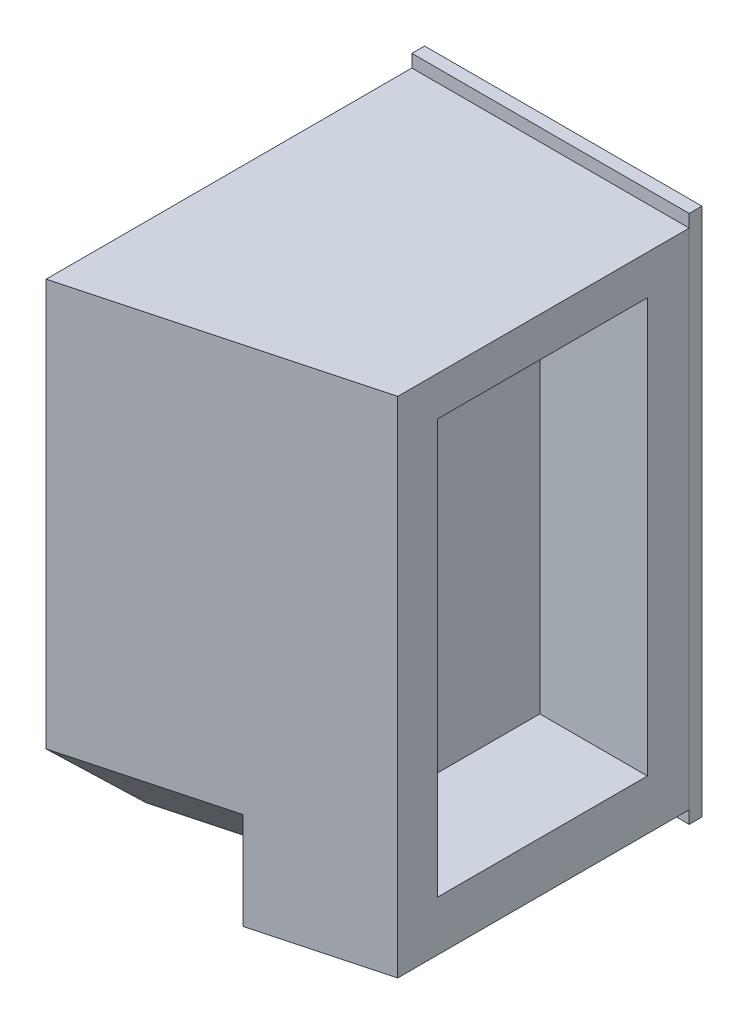
ISO-10303-21;
HEADER;
FILE_DESCRIPTION(('STEP AP214'),'2;1');
FILE_NAME('part.step','',(''),(''),'','','');
FILE_SCHEMA(('AUTOMOTIVE_DESIGN { 1 0 10303 214 1 1 1 1 }'));
ENDSEC;
DATA;
#1=APPLICATION_CONTEXT('core data for automotive mechanical design processes');
#2=APPLICATION_PROTOCOL_DEFINITION('international standard','automotive_design',2000,#1);
#3=PRODUCT_CONTEXT('',#1,'mechanical');
#4=PRODUCT('Part','Part','',(#3));
#5=PRODUCT_RELATED_PRODUCT_CATEGORY('part','',(#4));
#6=PRODUCT_DEFINITION_FORMATION('','',#4);
#7=PRODUCT_DEFINITION_CONTEXT('part definition',#1,'design');
#8=PRODUCT_DEFINITION('design','',#6,#7);
#9=PRODUCT_DEFINITION_SHAPE('','',#8);
#10=(LENGTH_UNIT() NAMED_UNIT(*) SI_UNIT(.MILLI.,.METRE.));
#11=(NAMED_UNIT(*) PLANE_ANGLE_UNIT() SI_UNIT($,.RADIAN.));
#12=(NAMED_UNIT(*) SI_UNIT($,.STERADIAN.) SOLID_ANGLE_UNIT());
#13=UNCERTAINTY_MEASURE_WITH_UNIT(LENGTH_MEASURE(1.E-05),#10,'distance_accuracy_value','');
#14=(GEOMETRIC_REPRESENTATION_CONTEXT(3) GLOBAL_UNCERTAINTY_ASSIGNED_CONTEXT((#13)) GLOBAL_UNIT_ASSIGNED_CONTEXT((#10,
#11,#12)) REPRESENTATION_CONTEXT('',''));
#15=CARTESIAN_POINT('',(0.,0.,0.));
#16=DIRECTION('',(0.,0.,1.));
#17=DIRECTION('',(1.,0.,0.));
#18=AXIS2_PLACEMENT_3D('',#15,#16,#17);
#19=CARTESIAN_POINT('',(-327.080348727841,506.318653049981,217.579868937784));
#20=DIRECTION('',(-1.,0.,0.));
#21=DIRECTION('',(0.,0.,1.));
#22=AXIS2_PLACEMENT_3D('',#19,#20,#21);
#23=PLANE('',#22);
#24=DIRECTION('',(0.,-1.,0.));
#25=VECTOR('',#24,1.);
#26=CARTESIAN_POINT('',(-327.080348727841,506.318653049981,232.579868937784));
#27=LINE('',#26,#25);
#28=CARTESIAN_POINT('',(-327.080348727841,521.318653049981,232.579868937784));
#29=VERTEX_POINT('',#28);
#30=CARTESIAN_POINT('',(-327.080348727841,-103.291624688066,232.579868937784));
#31=VERTEX_POINT('',#30);
#32=EDGE_CURVE('E239',#29,#31,#27,.T.);
#33=ORIENTED_EDGE('',*,*,#32,.F.);
#34=DIRECTION('',(0.,0.,1.));
#35=VECTOR('',#34,1.);
#36=CARTESIAN_POINT('',(-327.080348727841,521.318653049981,232.579868937784));
#37=LINE('',#36,#35);
#38=CARTESIAN_POINT('',(-327.080348727841,521.318653049981,217.579868937784));
#39=VERTEX_POINT('',#38);
#40=EDGE_CURVE('E231',#39,#29,#37,.T.);
#41=ORIENTED_EDGE('',*,*,#40,.F.);
#42=DIRECTION('',(0.,-1.,0.));
#43=VECTOR('',#42,1.);
#44=CARTESIAN_POINT('',(-327.080348727841,506.318653049981,217.579868937784));
#45=LINE('',#44,#43);
#46=CARTESIAN_POINT('',(-327.080348727841,-103.291624688066,217.579868937784));
#47=VERTEX_POINT('',#46);
#48=EDGE_CURVE('E240',#39,#47,#45,.T.);
#49=ORIENTED_EDGE('',*,*,#48,.T.);
#50=DIRECTION('',(0.,0.,1.));
#51=VECTOR('',#50,1.);
#52=CARTESIAN_POINT('',(-327.080348727841,-103.291624688066,232.579868937784));
#53=LINE('',#52,#51);
#54=EDGE_CURVE('E215',#47,#31,#53,.T.);
#55=ORIENTED_EDGE('',*,*,#54,.T.);
#56=EDGE_LOOP('',(#33,#41,#49,#55));
#57=FACE_BOUND('',#56,.T.);
#58=ADVANCED_FACE('F53',(#57),#23,.T.);
#59=CARTESIAN_POINT('',(0.305231487729579,506.318653049981,217.579868937784));
#60=DIRECTION('',(1.,0.,0.));
#61=DIRECTION('',(0.,1.,0.));
#62=AXIS2_PLACEMENT_3D('',#59,#60,#61);
#63=PLANE('',#62);
#64=DIRECTION('',(0.,1.,0.));
#65=VECTOR('',#64,1.);
#66=CARTESIAN_POINT('',(0.305231487729579,506.318653049981,232.579868937784));
#67=LINE('',#66,#65);
#68=CARTESIAN_POINT('',(0.305231487729651,-103.291624688066,232.579868937784));
#69=VERTEX_POINT('',#68);
#70=CARTESIAN_POINT('',(0.305231487729651,521.318653049981,232.579868937784));
#71=VERTEX_POINT('',#70);
#72=EDGE_CURVE('E244',#69,#71,#67,.T.);
#73=ORIENTED_EDGE('',*,*,#72,.F.);
#74=DIRECTION('',(0.,0.,-1.));
#75=VECTOR('',#74,1.);
#76=CARTESIAN_POINT('',(0.305231487729651,-103.291624688066,232.579868937784));
#77=LINE('',#76,#75);
#78=CARTESIAN_POINT('',(0.305231487729651,-103.291624688066,217.579868937784));
#79=VERTEX_POINT('',#78);
#80=EDGE_CURVE('E177',#69,#79,#77,.T.);
#81=ORIENTED_EDGE('',*,*,#80,.T.);
#82=DIRECTION('',(0.,1.,0.));
#83=VECTOR('',#82,1.);
#84=CARTESIAN_POINT('',(0.305231487729579,506.318653049981,217.579868937784));
#85=LINE('',#84,#83);
#86=CARTESIAN_POINT('',(0.305231487729651,521.318653049981,217.579868937784));
#87=VERTEX_POINT('',#86);
#88=EDGE_CURVE('E243',#79,#87,#85,.T.);
#89=ORIENTED_EDGE('',*,*,#88,.T.);
#90=DIRECTION('',(0.,0.,-1.));
#91=VECTOR('',#90,1.);
#92=CARTESIAN_POINT('',(0.305231487729651,521.318653049981,232.579868937784));
#93=LINE('',#92,#91);
#94=EDGE_CURVE('E223',#71,#87,#93,.T.);
#95=ORIENTED_EDGE('',*,*,#94,.F.);
#96=EDGE_LOOP('',(#73,#81,#89,#95));
#97=FACE_BOUND('',#96,.T.);
#98=ADVANCED_FACE('F293',(#97),#63,.T.);
#99=CARTESIAN_POINT('',(0.,0.,217.579868937784));
#100=DIRECTION('',(0.,0.,1.));
#101=DIRECTION('',(1.,0.,0.));
#102=AXIS2_PLACEMENT_3D('',#99,#100,#101);
#103=PLANE('',#102);
#104=DIRECTION('',(-1.,0.,0.));
#105=VECTOR('',#104,1.);
#106=CARTESIAN_POINT('',(-230.062558620056,275.256153049981,217.579868937784));
#107=LINE('',#106,#105);
#108=CARTESIAN_POINT('',(-96.7125586200556,275.256153049981,217.579868937784));
#109=VERTEX_POINT('',#108);
#110=CARTESIAN_POINT('',(-230.062558620056,275.256153049981,217.579868937784));
#111=VERTEX_POINT('',#110);
#112=EDGE_CURVE('E159',#109,#111,#107,.T.);
#113=ORIENTED_EDGE('',*,*,#112,.F.);
#114=DIRECTION('',(0.,-1.,0.));
#115=VECTOR('',#114,1.);
#116=CARTESIAN_POINT('',(-96.7125586200556,275.256153049981,217.579868937784));
#117=LINE('',#116,#115);
#118=CARTESIAN_POINT('',(-96.7125586200556,386.381153049981,217.579868937784));
#119=VERTEX_POINT('',#118);
#120=EDGE_CURVE('E68',#119,#109,#117,.T.);
#121=ORIENTED_EDGE('',*,*,#120,.F.);
#122=DIRECTION('',(1.,0.,0.));
#123=VECTOR('',#122,1.);
#124=CARTESIAN_POINT('',(-230.062558620056,386.381153049981,217.579868937784));
#125=LINE('',#124,#123);
#126=CARTESIAN_POINT('',(-230.062558620056,386.381153049981,217.579868937784));
#127=VERTEX_POINT('',#126);
#128=EDGE_CURVE('E167',#127,#119,#125,.T.);
#129=ORIENTED_EDGE('',*,*,#128,.F.);
#130=DIRECTION('',(0.,1.,0.));
#131=VECTOR('',#130,1.);
#132=CARTESIAN_POINT('',(-230.062558620056,275.256153049981,217.579868937784));
#133=LINE('',#132,#131);
#134=EDGE_CURVE('E148',#111,#127,#133,.T.);
#135=ORIENTED_EDGE('',*,*,#134,.F.);
#136=EDGE_LOOP('',(#113,#121,#129,#135));
#137=FACE_BOUND('',#136,.T.);
#138=DIRECTION('',(0.,-1.,0.));
#139=VECTOR('',#138,1.);
#140=CARTESIAN_POINT('',(-96.7125586200556,142.770875311934,217.579868937784));
#141=LINE('',#140,#139);
#142=CARTESIAN_POINT('',(-96.7125586200556,142.770875311934,217.579868937784));
#143=VERTEX_POINT('',#142);
#144=CARTESIAN_POINT('',(-96.7125586200556,31.6458753119341,217.579868937784));
#145=VERTEX_POINT('',#144);
#146=EDGE_CURVE('E184',#143,#145,#141,.T.);
#147=ORIENTED_EDGE('',*,*,#146,.F.);
#148=DIRECTION('',(1.,0.,0.));
#149=VECTOR('',#148,1.);
#150=CARTESIAN_POINT('',(-230.062558620056,142.770875311934,217.579868937784));
#151=LINE('',#150,#149);
#152=CARTESIAN_POINT('',(-230.062558620056,142.770875311934,217.579868937784));
#153=VERTEX_POINT('',#152);
#154=EDGE_CURVE('E76',#153,#143,#151,.T.);
#155=ORIENTED_EDGE('',*,*,#154,.F.);
#156=DIRECTION('',(0.,1.,0.));
#157=VECTOR('',#156,1.);
#158=CARTESIAN_POINT('',(-230.062558620056,142.770875311934,217.579868937784));
#159=LINE('',#158,#157);
#160=CARTESIAN_POINT('',(-230.062558620056,31.6458753119341,217.579868937784));
#161=VERTEX_POINT('',#160);
#162=EDGE_CURVE('E192',#161,#153,#159,.T.);
#163=ORIENTED_EDGE('',*,*,#162,.F.);
#164=DIRECTION('',(-1.,0.,0.));
#165=VECTOR('',#164,1.);
#166=CARTESIAN_POINT('',(-230.062558620056,31.6458753119341,217.579868937784));
#167=LINE('',#166,#165);
#168=EDGE_CURVE('E188',#145,#161,#167,.T.);
#169=ORIENTED_EDGE('',*,*,#168,.F.);
#170=EDGE_LOOP('',(#147,#155,#163,#169));
#171=FACE_BOUND('',#170,.T.);
#172=ORIENTED_EDGE('',*,*,#48,.F.);
#173=DIRECTION('',(-1.,0.,0.));
#174=VECTOR('',#173,1.);
#175=CARTESIAN_POINT('',(0.305231487729651,521.318653049981,217.579868937784));
#176=LINE('',#175,#174);
#177=EDGE_CURVE('E227',#87,#39,#176,.T.);
#178=ORIENTED_EDGE('',*,*,#177,.F.);
#179=ORIENTED_EDGE('',*,*,#88,.F.);
#180=DIRECTION('',(-1.,0.,0.));
#181=VECTOR('',#180,1.);
#182=CARTESIAN_POINT('',(0.305231487729651,-103.291624688066,217.579868937784));
#183=LINE('',#182,#181);
#184=EDGE_CURVE('E219',#79,#47,#183,.T.);
#185=ORIENTED_EDGE('',*,*,#184,.T.);
#186=EDGE_LOOP('',(#172,#178,#179,#185));
#187=FACE_BOUND('',#186,.T.);
#188=ADVANCED_FACE('F164',(#137,#171,#187),#103,.F.);
#189=CARTESIAN_POINT('',(0.,0.,232.579868937784));
#190=DIRECTION('',(0.,0.,1.));
#191=DIRECTION('',(1.,0.,0.));
#192=AXIS2_PLACEMENT_3D('',#189,#190,#191);
#193=PLANE('',#192);
#194=DIRECTION('',(0.,1.,0.));
#195=VECTOR('',#194,1.);
#196=CARTESIAN_POINT('',(-96.7125586200556,0.,232.579868937784));
#197=LINE('',#196,#195);
#198=CARTESIAN_POINT('',(-96.7125586200556,275.256153049981,232.579868937784));
#199=VERTEX_POINT('',#198);
#200=CARTESIAN_POINT('',(-96.7125586200556,386.381153049981,232.579868937784));
#201=VERTEX_POINT('',#200);
#202=EDGE_CURVE('E12',#199,#201,#197,.T.);
#203=ORIENTED_EDGE('',*,*,#202,.F.);
#204=DIRECTION('',(1.,0.,0.));
#205=VECTOR('',#204,1.);
#206=CARTESIAN_POINT('',(0.,275.256153049981,232.579868937784));
#207=LINE('',#206,#205);
#208=CARTESIAN_POINT('',(-230.062558620056,275.256153049981,232.579868937784));
#209=VERTEX_POINT('',#208);
#210=EDGE_CURVE('E264',#209,#199,#207,.T.);
#211=ORIENTED_EDGE('',*,*,#210,.F.);
#212=DIRECTION('',(0.,-1.,0.));
#213=VECTOR('',#212,1.);
#214=CARTESIAN_POINT('',(-230.062558620056,0.,232.579868937784));
#215=LINE('',#214,#213);
#216=CARTESIAN_POINT('',(-230.062558620056,386.381153049981,232.579868937784));
#217=VERTEX_POINT('',#216);
#218=EDGE_CURVE('E151',#217,#209,#215,.T.);
#219=ORIENTED_EDGE('',*,*,#218,.F.);
#220=DIRECTION('',(-1.,0.,0.));
#221=VECTOR('',#220,1.);
#222=CARTESIAN_POINT('',(0.,386.381153049981,232.579868937784));
#223=LINE('',#222,#221);
#224=EDGE_CURVE('E61',#201,#217,#223,.T.);
#225=ORIENTED_EDGE('',*,*,#224,.F.);
#226=EDGE_LOOP('',(#203,#211,#219,#225));
#227=FACE_BOUND('',#226,.T.);
#228=DIRECTION('',(-1.,0.,0.));
#229=VECTOR('',#228,1.);
#230=CARTESIAN_POINT('',(0.,142.770875311934,232.579868937784));
#231=LINE('',#230,#229);
#232=CARTESIAN_POINT('',(-96.7125586200556,142.770875311934,232.579868937784));
#233=VERTEX_POINT('',#232);
#234=CARTESIAN_POINT('',(-230.062558620056,142.770875311934,232.579868937784));
#235=VERTEX_POINT('',#234);
#236=EDGE_CURVE('E261',#233,#235,#231,.T.);
#237=ORIENTED_EDGE('',*,*,#236,.F.);
#238=DIRECTION('',(0.,1.,0.));
#239=VECTOR('',#238,1.);
#240=CARTESIAN_POINT('',(-96.7125586200556,0.,232.579868937784));
#241=LINE('',#240,#239);
#242=CARTESIAN_POINT('',(-96.7125586200556,31.6458753119341,232.579868937784));
#243=VERTEX_POINT('',#242);
#244=EDGE_CURVE('E247',#243,#233,#241,.T.);
#245=ORIENTED_EDGE('',*,*,#244,.F.);
#246=DIRECTION('',(1.,0.,0.));
#247=VECTOR('',#246,1.);
#248=CARTESIAN_POINT('',(0.,31.6458753119341,232.579868937784));
#249=LINE('',#248,#247);
#250=CARTESIAN_POINT('',(-230.062558620056,31.6458753119341,232.579868937784));
#251=VERTEX_POINT('',#250);
#252=EDGE_CURVE('E254',#251,#243,#249,.T.);
#253=ORIENTED_EDGE('',*,*,#252,.F.);
#254=DIRECTION('',(0.,-1.,0.));
#255=VECTOR('',#254,1.);
#256=CARTESIAN_POINT('',(-230.062558620056,0.,232.579868937784));
#257=LINE('',#256,#255);
#258=EDGE_CURVE('E258',#235,#251,#257,.T.);
#259=ORIENTED_EDGE('',*,*,#258,.F.);
#260=EDGE_LOOP('',(#237,#245,#253,#259));
#261=FACE_BOUND('',#260,.T.);
#262=ORIENTED_EDGE('',*,*,#32,.T.);
#263=DIRECTION('',(1.,0.,0.));
#264=VECTOR('',#263,1.);
#265=CARTESIAN_POINT('',(0.305231487729651,-103.291624688066,232.579868937784));
#266=LINE('',#265,#264);
#267=EDGE_CURVE('E211',#31,#69,#266,.T.);
#268=ORIENTED_EDGE('',*,*,#267,.T.);
#269=ORIENTED_EDGE('',*,*,#72,.T.);
#270=DIRECTION('',(1.,0.,0.));
#271=VECTOR('',#270,1.);
#272=CARTESIAN_POINT('',(0.305231487729651,521.318653049981,232.579868937784));
#273=LINE('',#272,#271);
#274=EDGE_CURVE('E235',#29,#71,#273,.T.);
#275=ORIENTED_EDGE('',*,*,#274,.F.);
#276=EDGE_LOOP('',(#262,#268,#269,#275));
#277=FACE_BOUND('',#276,.T.);
#278=ADVANCED_FACE('F275',(#227,#261,#277),#193,.T.);
#279=CARTESIAN_POINT('',(0.,521.318653049981,0.));
#280=DIRECTION('',(0.,1.,0.));
#281=DIRECTION('',(0.,0.,1.));
#282=AXIS2_PLACEMENT_3D('',#279,#280,#281);
#283=PLANE('',#282);
#284=ORIENTED_EDGE('',*,*,#94,.T.);
#285=ORIENTED_EDGE('',*,*,#177,.T.);
#286=ORIENTED_EDGE('',*,*,#40,.T.);
#287=ORIENTED_EDGE('',*,*,#274,.T.);
#288=EDGE_LOOP('',(#284,#285,#286,#287));
#289=FACE_BOUND('',#288,.T.);
#290=ADVANCED_FACE('F305',(#289),#283,.T.);
#291=CARTESIAN_POINT('',(0.,-103.291624688066,0.));
#292=DIRECTION('',(0.,-1.,0.));
#293=DIRECTION('',(0.,0.,1.));
#294=AXIS2_PLACEMENT_3D('',#291,#292,#293);
#295=PLANE('',#294);
#296=ORIENTED_EDGE('',*,*,#80,.F.);
#297=ORIENTED_EDGE('',*,*,#267,.F.);
#298=ORIENTED_EDGE('',*,*,#54,.F.);
#299=ORIENTED_EDGE('',*,*,#184,.F.);
#300=EDGE_LOOP('',(#296,#297,#298,#299));
#301=FACE_BOUND('',#300,.T.);
#302=ADVANCED_FACE('F311',(#301),#295,.T.);
#303=CARTESIAN_POINT('',(-230.062558620056,142.770875311934,664.379868937784));
#304=DIRECTION('',(0.,1.,0.));
#305=DIRECTION('',(0.,0.,1.));
#306=AXIS2_PLACEMENT_3D('',#303,#304,#305);
#307=PLANE('',#306);
#308=ORIENTED_EDGE('',*,*,#236,.T.);
#309=DIRECTION('',(0.,0.,-1.));
#310=VECTOR('',#309,1.);
#311=CARTESIAN_POINT('',(-230.062558620056,142.770875311934,664.379868937784));
#312=LINE('',#311,#310);
#313=EDGE_CURVE('E197',#235,#153,#312,.T.);
#314=ORIENTED_EDGE('',*,*,#313,.T.);
#315=ORIENTED_EDGE('',*,*,#154,.T.);
#316=DIRECTION('',(0.,0.,-1.));
#317=VECTOR('',#316,1.);
#318=CARTESIAN_POINT('',(-96.7125586200556,142.770875311934,664.379868937784));
#319=LINE('',#318,#317);
#320=EDGE_CURVE('E196',#233,#143,#319,.T.);
#321=ORIENTED_EDGE('',*,*,#320,.F.);
#322=EDGE_LOOP('',(#308,#314,#315,#321));
#323=FACE_BOUND('',#322,.T.);
#324=ADVANCED_FACE('F324',(#323),#307,.F.);
#325=CARTESIAN_POINT('',(-230.062558620056,142.770875311934,664.379868937784));
#326=DIRECTION('',(-1.,0.,0.));
#327=DIRECTION('',(0.,0.,1.));
#328=AXIS2_PLACEMENT_3D('',#325,#326,#327);
#329=PLANE('',#328);
#330=ORIENTED_EDGE('',*,*,#258,.T.);
#331=DIRECTION('',(0.,0.,-1.));
#332=VECTOR('',#331,1.);
#333=CARTESIAN_POINT('',(-230.062558620056,31.6458753119341,664.379868937784));
#334=LINE('',#333,#332);
#335=EDGE_CURVE('E200',#251,#161,#334,.T.);
#336=ORIENTED_EDGE('',*,*,#335,.T.);
#337=ORIENTED_EDGE('',*,*,#162,.T.);
#338=ORIENTED_EDGE('',*,*,#313,.F.);
#339=EDGE_LOOP('',(#330,#336,#337,#338));
#340=FACE_BOUND('',#339,.T.);
#341=ADVANCED_FACE('F326',(#340),#329,.F.);
#342=CARTESIAN_POINT('',(-230.062558620056,31.6458753119341,664.379868937784));
#343=DIRECTION('',(0.,-1.,0.));
#344=DIRECTION('',(0.,0.,-1.));
#345=AXIS2_PLACEMENT_3D('',#342,#343,#344);
#346=PLANE('',#345);
#347=ORIENTED_EDGE('',*,*,#252,.T.);
#348=DIRECTION('',(0.,0.,-1.));
#349=VECTOR('',#348,1.);
#350=CARTESIAN_POINT('',(-96.7125586200556,31.6458753119341,664.379868937784));
#351=LINE('',#350,#349);
#352=EDGE_CURVE('E203',#243,#145,#351,.T.);
#353=ORIENTED_EDGE('',*,*,#352,.T.);
#354=ORIENTED_EDGE('',*,*,#168,.T.);
#355=ORIENTED_EDGE('',*,*,#335,.F.);
#356=EDGE_LOOP('',(#347,#353,#354,#355));
#357=FACE_BOUND('',#356,.T.);
#358=ADVANCED_FACE('F287',(#357),#346,.F.);
#359=CARTESIAN_POINT('',(-96.7125586200556,142.770875311934,664.379868937784));
#360=DIRECTION('',(1.,0.,0.));
#361=DIRECTION('',(0.,0.,-1.));
#362=AXIS2_PLACEMENT_3D('',#359,#360,#361);
#363=PLANE('',#362);
#364=ORIENTED_EDGE('',*,*,#244,.T.);
#365=ORIENTED_EDGE('',*,*,#320,.T.);
#366=ORIENTED_EDGE('',*,*,#146,.T.);
#367=ORIENTED_EDGE('',*,*,#352,.F.);
#368=EDGE_LOOP('',(#364,#365,#366,#367));
#369=FACE_BOUND('',#368,.T.);
#370=ADVANCED_FACE('F280',(#369),#363,.F.);
#371=CARTESIAN_POINT('',(-96.7125586200556,275.256153049981,664.379868937784));
#372=DIRECTION('',(1.,0.,0.));
#373=DIRECTION('',(0.,0.,-1.));
#374=AXIS2_PLACEMENT_3D('',#371,#372,#373);
#375=PLANE('',#374);
#376=ORIENTED_EDGE('',*,*,#202,.T.);
#377=DIRECTION('',(0.,0.,-1.));
#378=VECTOR('',#377,1.);
#379=CARTESIAN_POINT('',(-96.7125586200556,386.381153049981,664.379868937784));
#380=LINE('',#379,#378);
#381=EDGE_CURVE('E174',#201,#119,#380,.T.);
#382=ORIENTED_EDGE('',*,*,#381,.T.);
#383=ORIENTED_EDGE('',*,*,#120,.T.);
#384=DIRECTION('',(0.,0.,-1.));
#385=VECTOR('',#384,1.);
#386=CARTESIAN_POINT('',(-96.7125586200556,275.256153049981,664.379868937784));
#387=LINE('',#386,#385);
#388=EDGE_CURVE('E156',#199,#109,#387,.T.);
#389=ORIENTED_EDGE('',*,*,#388,.F.);
#390=EDGE_LOOP('',(#376,#382,#383,#389));
#391=FACE_BOUND('',#390,.T.);
#392=ADVANCED_FACE('F277',(#391),#375,.F.);
#393=CARTESIAN_POINT('',(-230.062558620056,386.381153049981,664.379868937784));
#394=DIRECTION('',(0.,1.,0.));
#395=DIRECTION('',(0.,0.,1.));
#396=AXIS2_PLACEMENT_3D('',#393,#394,#395);
#397=PLANE('',#396);
#398=ORIENTED_EDGE('',*,*,#224,.T.);
#399=DIRECTION('',(0.,0.,-1.));
#400=VECTOR('',#399,1.);
#401=CARTESIAN_POINT('',(-230.062558620056,386.381153049981,664.379868937784));
#402=LINE('',#401,#400);
#403=EDGE_CURVE('E155',#217,#127,#402,.T.);
#404=ORIENTED_EDGE('',*,*,#403,.T.);
#405=ORIENTED_EDGE('',*,*,#128,.T.);
#406=ORIENTED_EDGE('',*,*,#381,.F.);
#407=EDGE_LOOP('',(#398,#404,#405,#406));
#408=FACE_BOUND('',#407,.T.);
#409=ADVANCED_FACE('F272',(#408),#397,.F.);
#410=CARTESIAN_POINT('',(-230.062558620056,275.256153049981,664.379868937784));
#411=DIRECTION('',(-1.,0.,0.));
#412=DIRECTION('',(0.,0.,1.));
#413=AXIS2_PLACEMENT_3D('',#410,#411,#412);
#414=PLANE('',#413);
#415=ORIENTED_EDGE('',*,*,#218,.T.);
#416=DIRECTION('',(0.,0.,-1.));
#417=VECTOR('',#416,1.);
#418=CARTESIAN_POINT('',(-230.062558620056,275.256153049981,664.379868937784));
#419=LINE('',#418,#417);
#420=EDGE_CURVE('E143',#209,#111,#419,.T.);
#421=ORIENTED_EDGE('',*,*,#420,.T.);
#422=ORIENTED_EDGE('',*,*,#134,.T.);
#423=ORIENTED_EDGE('',*,*,#403,.F.);
#424=EDGE_LOOP('',(#415,#421,#422,#423));
#425=FACE_BOUND('',#424,.T.);
#426=ADVANCED_FACE('F145',(#425),#414,.F.);
#427=CARTESIAN_POINT('',(-230.062558620056,275.256153049981,664.379868937784));
#428=DIRECTION('',(0.,-1.,0.));
#429=DIRECTION('',(0.,0.,-1.));
#430=AXIS2_PLACEMENT_3D('',#427,#428,#429);
#431=PLANE('',#430);
#432=ORIENTED_EDGE('',*,*,#210,.T.);
#433=ORIENTED_EDGE('',*,*,#388,.T.);
#434=ORIENTED_EDGE('',*,*,#112,.T.);
#435=ORIENTED_EDGE('',*,*,#420,.F.);
#436=EDGE_LOOP('',(#432,#433,#434,#435));
#437=FACE_BOUND('',#436,.T.);
#438=ADVANCED_FACE('F160',(#437),#431,.F.);
#439=CLOSED_SHELL('',(#58,#98,#188,#278,#290,#302,#324,#341,#358,#370,#392,#409,#426,#438));
#440=MANIFOLD_SOLID_BREP('B2',#439);
#441=CARTESIAN_POINT('',(-327.080348727841,506.318653049981,232.579868937784));
#442=DIRECTION('',(1.,0.,0.));
#443=DIRECTION('',(0.,0.,-1.));
#444=AXIS2_PLACEMENT_3D('',#441,#442,#443);
#445=PLANE('',#444);
#446=DIRECTION('',(0.,0.,-1.));
#447=VECTOR('',#446,1.);
#448=CARTESIAN_POINT('',(-327.080348727841,21.2583753119342,573.479868937784));
#449=LINE('',#448,#447);
#450=CARTESIAN_POINT('',(-327.080348727841,21.2583753119341,573.479868937784));
#451=VERTEX_POINT('',#450);
#452=CARTESIAN_POINT('',(-327.080348727841,21.2583753119342,323.479868937785));
#453=VERTEX_POINT('',#452);
#454=EDGE_CURVE('E644',#451,#453,#449,.T.);
#455=ORIENTED_EDGE('',*,*,#454,.T.);
#456=DIRECTION('',(0.,1.,0.));
#457=VECTOR('',#456,1.);
#458=CARTESIAN_POINT('',(-327.080348727841,221.258375311934,323.479868937785));
#459=LINE('',#458,#457);
#460=CARTESIAN_POINT('',(-327.080348727841,221.258375311934,323.479868937785));
#461=VERTEX_POINT('',#460);
#462=EDGE_CURVE('E664',#453,#461,#459,.T.);
#463=ORIENTED_EDGE('',*,*,#462,.T.);
#464=DIRECTION('',(0.,0.,1.));
#465=VECTOR('',#464,1.);
#466=CARTESIAN_POINT('',(-327.080348727841,221.258375311934,573.479868937784));
#467=LINE('',#466,#465);
#468=CARTESIAN_POINT('',(-327.080348727841,221.258375311934,573.479868937784));
#469=VERTEX_POINT('',#468);
#470=EDGE_CURVE('E667',#461,#469,#467,.T.);
#471=ORIENTED_EDGE('',*,*,#470,.T.);
#472=DIRECTION('',(0.,-1.,0.));
#473=VECTOR('',#472,1.);
#474=CARTESIAN_POINT('',(-327.080348727841,221.258375311934,573.479868937784));
#475=LINE('',#474,#473);
#476=EDGE_CURVE('E655',#469,#451,#475,.T.);
#477=ORIENTED_EDGE('',*,*,#476,.T.);
#478=EDGE_LOOP('',(#455,#463,#471,#477));
#479=FACE_BOUND('',#478,.T.);
#480=DIRECTION('',(0.,0.,1.));
#481=VECTOR('',#480,1.);
#482=CARTESIAN_POINT('',(-327.080348727841,350.023375311934,498.479868937784));
#483=LINE('',#482,#481);
#484=CARTESIAN_POINT('',(-327.080348727841,350.023375311934,398.479868937784));
#485=VERTEX_POINT('',#484);
#486=CARTESIAN_POINT('',(-327.080348727841,350.023375311934,498.479868937784));
#487=VERTEX_POINT('',#486);
#488=EDGE_CURVE('E634',#485,#487,#483,.T.);
#489=ORIENTED_EDGE('',*,*,#488,.F.);
#490=DIRECTION('',(0.,-1.,0.));
#491=VECTOR('',#490,1.);
#492=CARTESIAN_POINT('',(-327.080348727841,350.023375311934,398.479868937784));
#493=LINE('',#492,#491);
#494=CARTESIAN_POINT('',(-327.080348727841,450.023375311934,398.479868937784));
#495=VERTEX_POINT('',#494);
#496=EDGE_CURVE('E617',#495,#485,#493,.T.);
#497=ORIENTED_EDGE('',*,*,#496,.F.);
#498=DIRECTION('',(0.,0.,-1.));
#499=VECTOR('',#498,1.);
#500=CARTESIAN_POINT('',(-327.080348727841,450.023375311934,498.479868937784));
#501=LINE('',#500,#499);
#502=CARTESIAN_POINT('',(-327.080348727841,450.023375311934,498.479868937784));
#503=VERTEX_POINT('',#502);
#504=EDGE_CURVE('E623',#503,#495,#501,.T.);
#505=ORIENTED_EDGE('',*,*,#504,.F.);
#506=DIRECTION('',(0.,1.,0.));
#507=VECTOR('',#506,1.);
#508=CARTESIAN_POINT('',(-327.080348727841,350.023375311934,498.479868937784));
#509=LINE('',#508,#507);
#510=EDGE_CURVE('E637',#487,#503,#509,.T.);
#511=ORIENTED_EDGE('',*,*,#510,.F.);
#512=EDGE_LOOP('',(#489,#497,#505,#511));
#513=FACE_BOUND('',#512,.T.);
#514=DIRECTION('',(0.,-0.694746590606866,-0.719254596676403));
#515=VECTOR('',#514,1.);
#516=CARTESIAN_POINT('',(-327.080348727841,42.0707727069249,681.008886361099));
#517=LINE('',#516,#515);
#518=CARTESIAN_POINT('',(-327.080348727841,26.0083753119342,664.379868937784));
#519=VERTEX_POINT('',#518);
#520=CARTESIAN_POINT('',(-327.080348727841,-88.2916246880659,546.047801516912));
#521=VERTEX_POINT('',#520);
#522=EDGE_CURVE('E602',#519,#521,#517,.T.);
#523=ORIENTED_EDGE('',*,*,#522,.F.);
#524=DIRECTION('',(0.,-1.,0.));
#525=VECTOR('',#524,1.);
#526=CARTESIAN_POINT('',(-327.080348727841,506.318653049981,664.379868937784));
#527=LINE('',#526,#525);
#528=CARTESIAN_POINT('',(-327.080348727841,506.318653049981,664.379868937784));
#529=VERTEX_POINT('',#528);
#530=EDGE_CURVE('E51',#529,#519,#527,.T.);
#531=ORIENTED_EDGE('',*,*,#530,.F.);
#532=DIRECTION('',(0.,0.,1.));
#533=VECTOR('',#532,1.);
#534=CARTESIAN_POINT('',(-327.080348727841,506.318653049981,232.579868937784));
#535=LINE('',#534,#533);
#536=CARTESIAN_POINT('',(-327.080348727841,506.318653049981,232.579868937784));
#537=VERTEX_POINT('',#536);
#538=EDGE_CURVE('E714',#537,#529,#535,.T.);
#539=ORIENTED_EDGE('',*,*,#538,.F.);
#540=DIRECTION('',(0.,-1.,0.));
#541=VECTOR('',#540,1.);
#542=CARTESIAN_POINT('',(-327.080348727841,506.318653049981,232.579868937784));
#543=LINE('',#542,#541);
#544=CARTESIAN_POINT('',(-327.080348727841,26.0083753119342,232.579868937784));
#545=VERTEX_POINT('',#544);
#546=EDGE_CURVE('E724',#537,#545,#543,.T.);
#547=ORIENTED_EDGE('',*,*,#546,.T.);
#548=DIRECTION('',(0.,0.707106781186548,-0.707106781186548));
#549=VECTOR('',#548,1.);
#550=CARTESIAN_POINT('',(-327.080348727841,26.0083753119342,232.579868937784));
#551=LINE('',#550,#549);
#552=CARTESIAN_POINT('',(-327.080348727841,-88.2916246880658,346.879868937784));
#553=VERTEX_POINT('',#552);
#554=EDGE_CURVE('E606',#553,#545,#551,.T.);
#555=ORIENTED_EDGE('',*,*,#554,.F.);
#556=DIRECTION('',(0.,0.,1.));
#557=VECTOR('',#556,1.);
#558=CARTESIAN_POINT('',(-327.080348727841,-88.2916246880658,232.579868937784));
#559=LINE('',#558,#557);
#560=EDGE_CURVE('E707',#553,#521,#559,.T.);
#561=ORIENTED_EDGE('',*,*,#560,.T.);
#562=EDGE_LOOP('',(#523,#531,#539,#547,#555,#561));
#563=FACE_BOUND('',#562,.T.);
#564=ADVANCED_FACE('F449',(#479,#513,#563),#445,.F.);
#565=CARTESIAN_POINT('',(-327.080348727841,506.318653049981,664.379868937784));
#566=DIRECTION('',(-0.258819045102518,0.,-0.965925826289069));
#567=DIRECTION('',(-0.965925826289069,0.,0.258819045102518));
#568=AXIS2_PLACEMENT_3D('',#565,#566,#567);
#569=PLANE('',#568);
#570=DIRECTION('',(-0.965925826289069,0.,0.258819045102518));
#571=VECTOR('',#570,1.);
#572=CARTESIAN_POINT('',(-143.554441732918,26.0083753119342,615.204250368306));
#573=LINE('',#572,#571);
#574=CARTESIAN_POINT('',(-143.554441732918,26.0083753119342,615.204250368306));
#575=VERTEX_POINT('',#574);
#576=EDGE_CURVE('E587',#575,#519,#573,.T.);
#577=ORIENTED_EDGE('',*,*,#576,.F.);
#578=DIRECTION('',(0.,-1.,0.));
#579=VECTOR('',#578,1.);
#580=CARTESIAN_POINT('',(-143.554441732918,-88.2916246880658,615.204250368306));
#581=LINE('',#580,#579);
#582=CARTESIAN_POINT('',(-143.554441732918,-88.2916246880658,615.204250368306));
#583=VERTEX_POINT('',#582);
#584=EDGE_CURVE('E591',#575,#583,#581,.T.);
#585=ORIENTED_EDGE('',*,*,#584,.T.);
#586=DIRECTION('',(0.965925826289069,0.,-0.258819045102518));
#587=VECTOR('',#586,1.);
#588=CARTESIAN_POINT('',(-327.080348727841,-88.2916246880658,664.379868937784));
#589=LINE('',#588,#587);
#590=CARTESIAN_POINT('',(0.305231487729651,-88.2916246880658,576.657167105429));
#591=VERTEX_POINT('',#590);
#592=EDGE_CURVE('E727',#583,#591,#589,.T.);
#593=ORIENTED_EDGE('',*,*,#592,.T.);
#594=DIRECTION('',(0.,-1.,0.));
#595=VECTOR('',#594,1.);
#596=CARTESIAN_POINT('',(0.305231487729651,506.318653049981,576.657167105429));
#597=LINE('',#596,#595);
#598=CARTESIAN_POINT('',(0.305231487729651,506.318653049981,576.657167105429));
#599=VERTEX_POINT('',#598);
#600=EDGE_CURVE('E456',#599,#591,#597,.T.);
#601=ORIENTED_EDGE('',*,*,#600,.F.);
#602=DIRECTION('',(0.965925826289069,0.,-0.258819045102518));
#603=VECTOR('',#602,1.);
#604=CARTESIAN_POINT('',(-327.080348727841,506.318653049981,664.379868937784));
#605=LINE('',#604,#603);
#606=EDGE_CURVE('E717',#529,#599,#605,.T.);
#607=ORIENTED_EDGE('',*,*,#606,.F.);
#608=ORIENTED_EDGE('',*,*,#530,.T.);
#609=EDGE_LOOP('',(#577,#585,#593,#601,#607,#608));
#610=FACE_BOUND('',#609,.T.);
#611=ADVANCED_FACE('F599',(#610),#569,.F.);
#612=CARTESIAN_POINT('',(-327.080348727841,-88.2916246880658,232.579868937784));
#613=DIRECTION('',(0.,-1.,0.));
#614=DIRECTION('',(0.,0.,-1.));
#615=AXIS2_PLACEMENT_3D('',#612,#613,#614);
#616=PLANE('',#615);
#617=DIRECTION('',(-0.258819045102518,0.,-0.965925826289069));
#618=VECTOR('',#617,1.);
#619=CARTESIAN_POINT('',(-173.137458588136,-88.2916246880659,504.798928423465));
#620=LINE('',#619,#618);
#621=CARTESIAN_POINT('',(-173.137458588136,-88.2916246880658,504.798928423465));
#622=VERTEX_POINT('',#621);
#623=EDGE_CURVE('E592',#583,#622,#620,.T.);
#624=ORIENTED_EDGE('',*,*,#623,.T.);
#625=DIRECTION('',(-0.965925826289069,0.,0.258819045102518));
#626=VECTOR('',#625,1.);
#627=CARTESIAN_POINT('',(-173.137458588136,-88.2916246880659,504.798928423465));
#628=LINE('',#627,#626);
#629=EDGE_CURVE('E463',#622,#521,#628,.T.);
#630=ORIENTED_EDGE('',*,*,#629,.T.);
#631=ORIENTED_EDGE('',*,*,#560,.F.);
#632=DIRECTION('',(-1.,0.,0.));
#633=VECTOR('',#632,1.);
#634=CARTESIAN_POINT('',(-155.080348727841,-88.2916246880658,346.879868937784));
#635=LINE('',#634,#633);
#636=CARTESIAN_POINT('',(-155.080348727841,-88.2916246880658,346.879868937784));
#637=VERTEX_POINT('',#636);
#638=EDGE_CURVE('E612',#637,#553,#635,.T.);
#639=ORIENTED_EDGE('',*,*,#638,.F.);
#640=DIRECTION('',(0.,0.,1.));
#641=VECTOR('',#640,1.);
#642=CARTESIAN_POINT('',(-155.080348727841,-88.2916246880658,346.879868937784));
#643=LINE('',#642,#641);
#644=CARTESIAN_POINT('',(-155.080348727841,-88.2916246880658,232.579868937784));
#645=VERTEX_POINT('',#644);
#646=EDGE_CURVE('E608',#645,#637,#643,.T.);
#647=ORIENTED_EDGE('',*,*,#646,.F.);
#648=DIRECTION('',(-1.,0.,0.));
#649=VECTOR('',#648,1.);
#650=CARTESIAN_POINT('',(0.305231487729651,-88.2916246880658,232.579868937784));
#651=LINE('',#650,#649);
#652=CARTESIAN_POINT('',(0.305231487729651,-88.2916246880658,232.579868937784));
#653=VERTEX_POINT('',#652);
#654=EDGE_CURVE('E718',#653,#645,#651,.T.);
#655=ORIENTED_EDGE('',*,*,#654,.F.);
#656=DIRECTION('',(0.,0.,-1.));
#657=VECTOR('',#656,1.);
#658=CARTESIAN_POINT('',(0.305231487729651,-88.2916246880658,576.657167105429));
#659=LINE('',#658,#657);
#660=EDGE_CURVE('E729',#591,#653,#659,.T.);
#661=ORIENTED_EDGE('',*,*,#660,.F.);
#662=ORIENTED_EDGE('',*,*,#592,.F.);
#663=EDGE_LOOP('',(#624,#630,#631,#639,#647,#655,#661,#662));
#664=FACE_BOUND('',#663,.T.);
#665=ADVANCED_FACE('F746',(#664),#616,.T.);
#666=CARTESIAN_POINT('',(0.305231487729651,506.318653049981,576.657167105429));
#667=DIRECTION('',(-1.,0.,0.));
#668=DIRECTION('',(0.,0.,1.));
#669=AXIS2_PLACEMENT_3D('',#666,#667,#668);
#670=PLANE('',#669);
#671=DIRECTION('',(0.,0.,-1.));
#672=VECTOR('',#671,1.);
#673=CARTESIAN_POINT('',(0.305231487729651,-29.1371492785861,281.926314259797));
#674=LINE('',#673,#672);
#675=CARTESIAN_POINT('',(0.305231487729651,-29.1371492785861,529.576314259797));
#676=VERTEX_POINT('',#675);
#677=CARTESIAN_POINT('',(0.305231487729651,-29.1371492785861,281.926314259797));
#678=VERTEX_POINT('',#677);
#679=EDGE_CURVE('E697',#676,#678,#674,.T.);
#680=ORIENTED_EDGE('',*,*,#679,.F.);
#681=DIRECTION('',(0.,-1.,0.));
#682=VECTOR('',#681,1.);
#683=CARTESIAN_POINT('',(0.305231487729651,-29.1371492785862,529.576314259797));
#684=LINE('',#683,#682);
#685=CARTESIAN_POINT('',(0.305231487729651,459.812850721414,529.576314259797));
#686=VERTEX_POINT('',#685);
#687=EDGE_CURVE('E681',#686,#676,#684,.T.);
#688=ORIENTED_EDGE('',*,*,#687,.F.);
#689=DIRECTION('',(0.,0.,1.));
#690=VECTOR('',#689,1.);
#691=CARTESIAN_POINT('',(0.305231487729651,459.812850721414,281.926314259797));
#692=LINE('',#691,#690);
#693=CARTESIAN_POINT('',(0.305231487729651,459.812850721414,281.926314259797));
#694=VERTEX_POINT('',#693);
#695=EDGE_CURVE('E686',#694,#686,#692,.T.);
#696=ORIENTED_EDGE('',*,*,#695,.F.);
#697=DIRECTION('',(0.,1.,0.));
#698=VECTOR('',#697,1.);
#699=CARTESIAN_POINT('',(0.305231487729651,-29.1371492785861,281.926314259797));
#700=LINE('',#699,#698);
#701=EDGE_CURVE('E700',#678,#694,#700,.T.);
#702=ORIENTED_EDGE('',*,*,#701,.F.);
#703=EDGE_LOOP('',(#680,#688,#696,#702));
#704=FACE_BOUND('',#703,.T.);
#705=ORIENTED_EDGE('',*,*,#660,.T.);
#706=DIRECTION('',(0.,-1.,0.));
#707=VECTOR('',#706,1.);
#708=CARTESIAN_POINT('',(0.305231487729651,506.318653049981,232.579868937784));
#709=LINE('',#708,#707);
#710=CARTESIAN_POINT('',(0.305231487729651,506.318653049981,232.579868937784));
#711=VERTEX_POINT('',#710);
#712=EDGE_CURVE('E735',#711,#653,#709,.T.);
#713=ORIENTED_EDGE('',*,*,#712,.F.);
#714=DIRECTION('',(0.,0.,-1.));
#715=VECTOR('',#714,1.);
#716=CARTESIAN_POINT('',(0.305231487729651,506.318653049981,576.657167105429));
#717=LINE('',#716,#715);
#718=EDGE_CURVE('E720',#599,#711,#717,.T.);
#719=ORIENTED_EDGE('',*,*,#718,.F.);
#720=ORIENTED_EDGE('',*,*,#600,.T.);
#721=EDGE_LOOP('',(#705,#713,#719,#720));
#722=FACE_BOUND('',#721,.T.);
#723=ADVANCED_FACE('F742',(#704,#722),#670,.F.);
#724=CARTESIAN_POINT('',(0.305231487729651,506.318653049981,232.579868937784));
#725=DIRECTION('',(0.,0.,1.));
#726=DIRECTION('',(1.,0.,0.));
#727=AXIS2_PLACEMENT_3D('',#724,#725,#726);
#728=PLANE('',#727);
#729=DIRECTION('',(0.,-1.,0.));
#730=VECTOR('',#729,1.);
#731=CARTESIAN_POINT('',(-155.080348727841,-88.2916246880658,232.579868937784));
#732=LINE('',#731,#730);
#733=CARTESIAN_POINT('',(-155.080348727841,26.0083753119342,232.579868937784));
#734=VERTEX_POINT('',#733);
#735=EDGE_CURVE('E471',#734,#645,#732,.T.);
#736=ORIENTED_EDGE('',*,*,#735,.F.);
#737=DIRECTION('',(-1.,0.,0.));
#738=VECTOR('',#737,1.);
#739=CARTESIAN_POINT('',(-155.080348727841,26.0083753119342,232.579868937784));
#740=LINE('',#739,#738);
#741=EDGE_CURVE('E614',#734,#545,#740,.T.);
#742=ORIENTED_EDGE('',*,*,#741,.T.);
#743=ORIENTED_EDGE('',*,*,#546,.F.);
#744=DIRECTION('',(-1.,0.,0.));
#745=VECTOR('',#744,1.);
#746=CARTESIAN_POINT('',(0.305231487729651,506.318653049981,232.579868937784));
#747=LINE('',#746,#745);
#748=EDGE_CURVE('E722',#711,#537,#747,.T.);
#749=ORIENTED_EDGE('',*,*,#748,.F.);
#750=ORIENTED_EDGE('',*,*,#712,.T.);
#751=ORIENTED_EDGE('',*,*,#654,.T.);
#752=EDGE_LOOP('',(#736,#742,#743,#749,#750,#751));
#753=FACE_BOUND('',#752,.T.);
#754=ADVANCED_FACE('F749',(#753),#728,.F.);
#755=CARTESIAN_POINT('',(-327.080348727841,506.318653049981,232.579868937784));
#756=DIRECTION('',(0.,-1.,0.));
#757=DIRECTION('',(0.,0.,-1.));
#758=AXIS2_PLACEMENT_3D('',#755,#756,#757);
#759=PLANE('',#758);
#760=ORIENTED_EDGE('',*,*,#538,.T.);
#761=ORIENTED_EDGE('',*,*,#606,.T.);
#762=ORIENTED_EDGE('',*,*,#718,.T.);
#763=ORIENTED_EDGE('',*,*,#748,.T.);
#764=EDGE_LOOP('',(#760,#761,#762,#763));
#765=FACE_BOUND('',#764,.T.);
#766=ADVANCED_FACE('F754',(#765),#759,.F.);
#767=CARTESIAN_POINT('',(-126.69476851227,-29.1371492785862,529.576314259797));
#768=DIRECTION('',(0.,0.,1.));
#769=DIRECTION('',(1.,0.,0.));
#770=AXIS2_PLACEMENT_3D('',#767,#768,#769);
#771=PLANE('',#770);
#772=ORIENTED_EDGE('',*,*,#687,.T.);
#773=DIRECTION('',(1.,0.,0.));
#774=VECTOR('',#773,1.);
#775=CARTESIAN_POINT('',(-126.69476851227,-29.1371492785862,529.576314259797));
#776=LINE('',#775,#774);
#777=CARTESIAN_POINT('',(-126.69476851227,-29.1371492785862,529.576314259797));
#778=VERTEX_POINT('',#777);
#779=EDGE_CURVE('E695',#778,#676,#776,.T.);
#780=ORIENTED_EDGE('',*,*,#779,.F.);
#781=DIRECTION('',(0.,-1.,0.));
#782=VECTOR('',#781,1.);
#783=CARTESIAN_POINT('',(-126.69476851227,-29.1371492785862,529.576314259797));
#784=LINE('',#783,#782);
#785=CARTESIAN_POINT('',(-126.69476851227,459.812850721414,529.576314259797));
#786=VERTEX_POINT('',#785);
#787=EDGE_CURVE('E682',#786,#778,#784,.T.);
#788=ORIENTED_EDGE('',*,*,#787,.F.);
#789=DIRECTION('',(1.,0.,0.));
#790=VECTOR('',#789,1.);
#791=CARTESIAN_POINT('',(-126.69476851227,459.812850721414,529.576314259797));
#792=LINE('',#791,#790);
#793=EDGE_CURVE('E705',#786,#686,#792,.T.);
#794=ORIENTED_EDGE('',*,*,#793,.T.);
#795=EDGE_LOOP('',(#772,#780,#788,#794));
#796=FACE_BOUND('',#795,.T.);
#797=ADVANCED_FACE('F837',(#796),#771,.F.);
#798=CARTESIAN_POINT('',(-126.69476851227,459.812850721414,281.926314259797));
#799=DIRECTION('',(0.,1.,0.));
#800=DIRECTION('',(0.,0.,1.));
#801=AXIS2_PLACEMENT_3D('',#798,#799,#800);
#802=PLANE('',#801);
#803=ORIENTED_EDGE('',*,*,#695,.T.);
#804=ORIENTED_EDGE('',*,*,#793,.F.);
#805=DIRECTION('',(0.,0.,1.));
#806=VECTOR('',#805,1.);
#807=CARTESIAN_POINT('',(-126.69476851227,459.812850721414,281.926314259797));
#808=LINE('',#807,#806);
#809=CARTESIAN_POINT('',(-126.69476851227,459.812850721414,281.926314259797));
#810=VERTEX_POINT('',#809);
#811=EDGE_CURVE('E692',#810,#786,#808,.T.);
#812=ORIENTED_EDGE('',*,*,#811,.F.);
#813=DIRECTION('',(1.,0.,0.));
#814=VECTOR('',#813,1.);
#815=CARTESIAN_POINT('',(-126.69476851227,459.812850721414,281.926314259797));
#816=LINE('',#815,#814);
#817=EDGE_CURVE('E708',#810,#694,#816,.T.);
#818=ORIENTED_EDGE('',*,*,#817,.T.);
#819=EDGE_LOOP('',(#803,#804,#812,#818));
#820=FACE_BOUND('',#819,.T.);
#821=ADVANCED_FACE('F833',(#820),#802,.F.);
#822=CARTESIAN_POINT('',(-126.69476851227,-29.1371492785861,281.926314259797));
#823=DIRECTION('',(0.,0.,-1.));
#824=DIRECTION('',(-1.,0.,0.));
#825=AXIS2_PLACEMENT_3D('',#822,#823,#824);
#826=PLANE('',#825);
#827=ORIENTED_EDGE('',*,*,#701,.T.);
#828=ORIENTED_EDGE('',*,*,#817,.F.);
#829=DIRECTION('',(0.,1.,0.));
#830=VECTOR('',#829,1.);
#831=CARTESIAN_POINT('',(-126.69476851227,-29.1371492785861,281.926314259797));
#832=LINE('',#831,#830);
#833=CARTESIAN_POINT('',(-126.69476851227,-29.1371492785861,281.926314259797));
#834=VERTEX_POINT('',#833);
#835=EDGE_CURVE('E689',#834,#810,#832,.T.);
#836=ORIENTED_EDGE('',*,*,#835,.F.);
#837=DIRECTION('',(1.,0.,0.));
#838=VECTOR('',#837,1.);
#839=CARTESIAN_POINT('',(-126.69476851227,-29.1371492785861,281.926314259797));
#840=LINE('',#839,#838);
#841=EDGE_CURVE('E710',#834,#678,#840,.T.);
#842=ORIENTED_EDGE('',*,*,#841,.T.);
#843=EDGE_LOOP('',(#827,#828,#836,#842));
#844=FACE_BOUND('',#843,.T.);
#845=ADVANCED_FACE('F836',(#844),#826,.F.);
#846=CARTESIAN_POINT('',(-126.69476851227,-29.1371492785861,281.926314259797));
#847=DIRECTION('',(0.,-1.,0.));
#848=DIRECTION('',(0.,0.,-1.));
#849=AXIS2_PLACEMENT_3D('',#846,#847,#848);
#850=PLANE('',#849);
#851=ORIENTED_EDGE('',*,*,#679,.T.);
#852=ORIENTED_EDGE('',*,*,#841,.F.);
#853=DIRECTION('',(0.,0.,-1.));
#854=VECTOR('',#853,1.);
#855=CARTESIAN_POINT('',(-126.69476851227,-29.1371492785861,281.926314259797));
#856=LINE('',#855,#854);
#857=EDGE_CURVE('E685',#778,#834,#856,.T.);
#858=ORIENTED_EDGE('',*,*,#857,.F.);
#859=ORIENTED_EDGE('',*,*,#779,.T.);
#860=EDGE_LOOP('',(#851,#852,#858,#859));
#861=FACE_BOUND('',#860,.T.);
#862=ADVANCED_FACE('F831',(#861),#850,.F.);
#863=CARTESIAN_POINT('',(-126.69476851227,-88.2916246880658,232.579868937784));
#864=DIRECTION('',(1.,0.,0.));
#865=DIRECTION('',(0.,0.,-1.));
#866=AXIS2_PLACEMENT_3D('',#863,#864,#865);
#867=PLANE('',#866);
#868=ORIENTED_EDGE('',*,*,#787,.T.);
#869=ORIENTED_EDGE('',*,*,#857,.T.);
#870=ORIENTED_EDGE('',*,*,#835,.T.);
#871=ORIENTED_EDGE('',*,*,#811,.T.);
#872=EDGE_LOOP('',(#868,#869,#870,#871));
#873=FACE_BOUND('',#872,.T.);
#874=ADVANCED_FACE('F827',(#873),#867,.T.);
#875=CARTESIAN_POINT('',(-227.080348727841,21.2583753119342,573.479868937784));
#876=DIRECTION('',(0.,1.,0.));
#877=DIRECTION('',(0.,0.,1.));
#878=AXIS2_PLACEMENT_3D('',#875,#876,#877);
#879=PLANE('',#878);
#880=ORIENTED_EDGE('',*,*,#454,.F.);
#881=DIRECTION('',(-1.,0.,0.));
#882=VECTOR('',#881,1.);
#883=CARTESIAN_POINT('',(-227.080348727841,21.2583753119342,573.479868937784));
#884=LINE('',#883,#882);
#885=CARTESIAN_POINT('',(-227.080348727841,21.2583753119342,573.479868937784));
#886=VERTEX_POINT('',#885);
#887=EDGE_CURVE('E661',#886,#451,#884,.T.);
#888=ORIENTED_EDGE('',*,*,#887,.F.);
#889=DIRECTION('',(0.,0.,-1.));
#890=VECTOR('',#889,1.);
#891=CARTESIAN_POINT('',(-227.080348727841,21.2583753119342,573.479868937784));
#892=LINE('',#891,#890);
#893=CARTESIAN_POINT('',(-227.080348727841,21.2583753119342,323.479868937785));
#894=VERTEX_POINT('',#893);
#895=EDGE_CURVE('E651',#886,#894,#892,.T.);
#896=ORIENTED_EDGE('',*,*,#895,.T.);
#897=DIRECTION('',(-1.,0.,0.));
#898=VECTOR('',#897,1.);
#899=CARTESIAN_POINT('',(-227.080348727841,21.2583753119342,323.479868937785));
#900=LINE('',#899,#898);
#901=EDGE_CURVE('E678',#894,#453,#900,.T.);
#902=ORIENTED_EDGE('',*,*,#901,.T.);
#903=EDGE_LOOP('',(#880,#888,#896,#902));
#904=FACE_BOUND('',#903,.T.);
#905=ADVANCED_FACE('F823',(#904),#879,.T.);
#906=CARTESIAN_POINT('',(-227.080348727841,221.258375311934,323.479868937785));
#907=DIRECTION('',(0.,0.,1.));
#908=DIRECTION('',(1.,0.,0.));
#909=AXIS2_PLACEMENT_3D('',#906,#907,#908);
#910=PLANE('',#909);
#911=ORIENTED_EDGE('',*,*,#462,.F.);
#912=ORIENTED_EDGE('',*,*,#901,.F.);
#913=DIRECTION('',(0.,1.,0.));
#914=VECTOR('',#913,1.);
#915=CARTESIAN_POINT('',(-227.080348727841,221.258375311934,323.479868937785));
#916=LINE('',#915,#914);
#917=CARTESIAN_POINT('',(-227.080348727841,221.258375311934,323.479868937785));
#918=VERTEX_POINT('',#917);
#919=EDGE_CURVE('E654',#894,#918,#916,.T.);
#920=ORIENTED_EDGE('',*,*,#919,.T.);
#921=DIRECTION('',(-1.,0.,0.));
#922=VECTOR('',#921,1.);
#923=CARTESIAN_POINT('',(-227.080348727841,221.258375311934,323.479868937785));
#924=LINE('',#923,#922);
#925=EDGE_CURVE('E676',#918,#461,#924,.T.);
#926=ORIENTED_EDGE('',*,*,#925,.T.);
#927=EDGE_LOOP('',(#911,#912,#920,#926));
#928=FACE_BOUND('',#927,.T.);
#929=ADVANCED_FACE('F819',(#928),#910,.T.);
#930=CARTESIAN_POINT('',(-227.080348727841,221.258375311934,573.479868937784));
#931=DIRECTION('',(0.,-1.,0.));
#932=DIRECTION('',(0.,0.,-1.));
#933=AXIS2_PLACEMENT_3D('',#930,#931,#932);
#934=PLANE('',#933);
#935=ORIENTED_EDGE('',*,*,#470,.F.);
#936=ORIENTED_EDGE('',*,*,#925,.F.);
#937=DIRECTION('',(0.,0.,1.));
#938=VECTOR('',#937,1.);
#939=CARTESIAN_POINT('',(-227.080348727841,221.258375311934,573.479868937784));
#940=LINE('',#939,#938);
#941=CARTESIAN_POINT('',(-227.080348727841,221.258375311934,573.479868937784));
#942=VERTEX_POINT('',#941);
#943=EDGE_CURVE('E657',#918,#942,#940,.T.);
#944=ORIENTED_EDGE('',*,*,#943,.T.);
#945=DIRECTION('',(-1.,0.,0.));
#946=VECTOR('',#945,1.);
#947=CARTESIAN_POINT('',(-227.080348727841,221.258375311934,573.479868937784));
#948=LINE('',#947,#946);
#949=EDGE_CURVE('E674',#942,#469,#948,.T.);
#950=ORIENTED_EDGE('',*,*,#949,.T.);
#951=EDGE_LOOP('',(#935,#936,#944,#950));
#952=FACE_BOUND('',#951,.T.);
#953=ADVANCED_FACE('F815',(#952),#934,.T.);
#954=CARTESIAN_POINT('',(-227.080348727841,221.258375311934,573.479868937784));
#955=DIRECTION('',(0.,0.,-1.));
#956=DIRECTION('',(-1.,0.,0.));
#957=AXIS2_PLACEMENT_3D('',#954,#955,#956);
#958=PLANE('',#957);
#959=ORIENTED_EDGE('',*,*,#476,.F.);
#960=ORIENTED_EDGE('',*,*,#949,.F.);
#961=DIRECTION('',(0.,-1.,0.));
#962=VECTOR('',#961,1.);
#963=CARTESIAN_POINT('',(-227.080348727841,221.258375311934,573.479868937784));
#964=LINE('',#963,#962);
#965=EDGE_CURVE('E659',#942,#886,#964,.T.);
#966=ORIENTED_EDGE('',*,*,#965,.T.);
#967=ORIENTED_EDGE('',*,*,#887,.T.);
#968=EDGE_LOOP('',(#959,#960,#966,#967));
#969=FACE_BOUND('',#968,.T.);
#970=ADVANCED_FACE('F811',(#969),#958,.T.);
#971=CARTESIAN_POINT('',(-227.080348727841,-88.2916246880658,232.579868937784));
#972=DIRECTION('',(-1.,0.,0.));
#973=DIRECTION('',(0.,0.,1.));
#974=AXIS2_PLACEMENT_3D('',#971,#972,#973);
#975=PLANE('',#974);
#976=ORIENTED_EDGE('',*,*,#895,.F.);
#977=ORIENTED_EDGE('',*,*,#965,.F.);
#978=ORIENTED_EDGE('',*,*,#943,.F.);
#979=ORIENTED_EDGE('',*,*,#919,.F.);
#980=EDGE_LOOP('',(#976,#977,#978,#979));
#981=FACE_BOUND('',#980,.T.);
#982=ADVANCED_FACE('F808',(#981),#975,.T.);
#983=CARTESIAN_POINT('',(-227.080348727841,350.023375311934,398.479868937784));
#984=DIRECTION('',(0.,0.,-1.));
#985=DIRECTION('',(-1.,0.,0.));
#986=AXIS2_PLACEMENT_3D('',#983,#984,#985);
#987=PLANE('',#986);
#988=ORIENTED_EDGE('',*,*,#496,.T.);
#989=DIRECTION('',(-1.,0.,0.));
#990=VECTOR('',#989,1.);
#991=CARTESIAN_POINT('',(-227.080348727841,350.023375311934,398.479868937784));
#992=LINE('',#991,#990);
#993=CARTESIAN_POINT('',(-227.080348727841,350.023375311934,398.479868937784));
#994=VERTEX_POINT('',#993);
#995=EDGE_CURVE('E632',#994,#485,#992,.T.);
#996=ORIENTED_EDGE('',*,*,#995,.F.);
#997=DIRECTION('',(0.,-1.,0.));
#998=VECTOR('',#997,1.);
#999=CARTESIAN_POINT('',(-227.080348727841,350.023375311934,398.479868937784));
#1000=LINE('',#999,#998);
#1001=CARTESIAN_POINT('',(-227.080348727841,450.023375311934,398.479868937784));
#1002=VERTEX_POINT('',#1001);
#1003=EDGE_CURVE('E619',#1002,#994,#1000,.T.);
#1004=ORIENTED_EDGE('',*,*,#1003,.F.);
#1005=DIRECTION('',(-1.,0.,0.));
#1006=VECTOR('',#1005,1.);
#1007=CARTESIAN_POINT('',(-227.080348727841,450.023375311934,398.479868937784));
#1008=LINE('',#1007,#1006);
#1009=EDGE_CURVE('E642',#1002,#495,#1008,.T.);
#1010=ORIENTED_EDGE('',*,*,#1009,.T.);
#1011=EDGE_LOOP('',(#988,#996,#1004,#1010));
#1012=FACE_BOUND('',#1011,.T.);
#1013=ADVANCED_FACE('F788',(#1012),#987,.F.);
#1014=CARTESIAN_POINT('',(-227.080348727841,450.023375311934,498.479868937784));
#1015=DIRECTION('',(0.,1.,0.));
#1016=DIRECTION('',(0.,0.,1.));
#1017=AXIS2_PLACEMENT_3D('',#1014,#1015,#1016);
#1018=PLANE('',#1017);
#1019=ORIENTED_EDGE('',*,*,#504,.T.);
#1020=ORIENTED_EDGE('',*,*,#1009,.F.);
#1021=DIRECTION('',(0.,0.,-1.));
#1022=VECTOR('',#1021,1.);
#1023=CARTESIAN_POINT('',(-227.080348727841,450.023375311934,498.479868937784));
#1024=LINE('',#1023,#1022);
#1025=CARTESIAN_POINT('',(-227.080348727841,450.023375311934,498.479868937784));
#1026=VERTEX_POINT('',#1025);
#1027=EDGE_CURVE('E629',#1026,#1002,#1024,.T.);
#1028=ORIENTED_EDGE('',*,*,#1027,.F.);
#1029=DIRECTION('',(-1.,0.,0.));
#1030=VECTOR('',#1029,1.);
#1031=CARTESIAN_POINT('',(-227.080348727841,450.023375311934,498.479868937784));
#1032=LINE('',#1031,#1030);
#1033=EDGE_CURVE('E645',#1026,#503,#1032,.T.);
#1034=ORIENTED_EDGE('',*,*,#1033,.T.);
#1035=EDGE_LOOP('',(#1019,#1020,#1028,#1034));
#1036=FACE_BOUND('',#1035,.T.);
#1037=ADVANCED_FACE('F791',(#1036),#1018,.F.);
#1038=CARTESIAN_POINT('',(-227.080348727841,350.023375311934,498.479868937784));
#1039=DIRECTION('',(0.,0.,1.));
#1040=DIRECTION('',(1.,0.,0.));
#1041=AXIS2_PLACEMENT_3D('',#1038,#1039,#1040);
#1042=PLANE('',#1041);
#1043=ORIENTED_EDGE('',*,*,#510,.T.);
#1044=ORIENTED_EDGE('',*,*,#1033,.F.);
#1045=DIRECTION('',(0.,1.,0.));
#1046=VECTOR('',#1045,1.);
#1047=CARTESIAN_POINT('',(-227.080348727841,350.023375311934,498.479868937784));
#1048=LINE('',#1047,#1046);
#1049=CARTESIAN_POINT('',(-227.080348727841,350.023375311934,498.479868937784));
#1050=VERTEX_POINT('',#1049);
#1051=EDGE_CURVE('E626',#1050,#1026,#1048,.T.);
#1052=ORIENTED_EDGE('',*,*,#1051,.F.);
#1053=DIRECTION('',(-1.,0.,0.));
#1054=VECTOR('',#1053,1.);
#1055=CARTESIAN_POINT('',(-227.080348727841,350.023375311934,498.479868937784));
#1056=LINE('',#1055,#1054);
#1057=EDGE_CURVE('E647',#1050,#487,#1056,.T.);
#1058=ORIENTED_EDGE('',*,*,#1057,.T.);
#1059=EDGE_LOOP('',(#1043,#1044,#1052,#1058));
#1060=FACE_BOUND('',#1059,.T.);
#1061=ADVANCED_FACE('F793',(#1060),#1042,.F.);
#1062=CARTESIAN_POINT('',(-227.080348727841,350.023375311934,498.479868937784));
#1063=DIRECTION('',(0.,-1.,0.));
#1064=DIRECTION('',(0.,0.,-1.));
#1065=AXIS2_PLACEMENT_3D('',#1062,#1063,#1064);
#1066=PLANE('',#1065);
#1067=ORIENTED_EDGE('',*,*,#488,.T.);
#1068=ORIENTED_EDGE('',*,*,#1057,.F.);
#1069=DIRECTION('',(0.,0.,1.));
#1070=VECTOR('',#1069,1.);
#1071=CARTESIAN_POINT('',(-227.080348727841,350.023375311934,498.479868937784));
#1072=LINE('',#1071,#1070);
#1073=EDGE_CURVE('E622',#994,#1050,#1072,.T.);
#1074=ORIENTED_EDGE('',*,*,#1073,.F.);
#1075=ORIENTED_EDGE('',*,*,#995,.T.);
#1076=EDGE_LOOP('',(#1067,#1068,#1074,#1075));
#1077=FACE_BOUND('',#1076,.T.);
#1078=ADVANCED_FACE('F783',(#1077),#1066,.F.);
#1079=CARTESIAN_POINT('',(-227.080348727841,-88.2916246880658,232.579868937784));
#1080=DIRECTION('',(-1.,0.,0.));
#1081=DIRECTION('',(0.,0.,1.));
#1082=AXIS2_PLACEMENT_3D('',#1079,#1080,#1081);
#1083=PLANE('',#1082);
#1084=ORIENTED_EDGE('',*,*,#1003,.T.);
#1085=ORIENTED_EDGE('',*,*,#1073,.T.);
#1086=ORIENTED_EDGE('',*,*,#1051,.T.);
#1087=ORIENTED_EDGE('',*,*,#1027,.T.);
#1088=EDGE_LOOP('',(#1084,#1085,#1086,#1087));
#1089=FACE_BOUND('',#1088,.T.);
#1090=ADVANCED_FACE('F770',(#1089),#1083,.T.);
#1091=CARTESIAN_POINT('',(-155.080348727841,26.0083753119342,232.579868937784));
#1092=DIRECTION('',(0.,0.707106781186548,0.707106781186548));
#1093=DIRECTION('',(0.,-0.707106781186548,0.707106781186548));
#1094=AXIS2_PLACEMENT_3D('',#1091,#1092,#1093);
#1095=PLANE('',#1094);
#1096=ORIENTED_EDGE('',*,*,#554,.T.);
#1097=ORIENTED_EDGE('',*,*,#741,.F.);
#1098=DIRECTION('',(0.,0.707106781186548,-0.707106781186548));
#1099=VECTOR('',#1098,1.);
#1100=CARTESIAN_POINT('',(-155.080348727841,26.0083753119342,232.579868937784));
#1101=LINE('',#1100,#1099);
#1102=EDGE_CURVE('E610',#637,#734,#1101,.T.);
#1103=ORIENTED_EDGE('',*,*,#1102,.F.);
#1104=ORIENTED_EDGE('',*,*,#638,.T.);
#1105=EDGE_LOOP('',(#1096,#1097,#1103,#1104));
#1106=FACE_BOUND('',#1105,.T.);
#1107=ADVANCED_FACE('F761',(#1106),#1095,.F.);
#1108=CARTESIAN_POINT('',(-155.080348727841,-88.2916246880658,232.579868937784));
#1109=DIRECTION('',(-1.,0.,0.));
#1110=DIRECTION('',(0.,0.,1.));
#1111=AXIS2_PLACEMENT_3D('',#1108,#1109,#1110);
#1112=PLANE('',#1111);
#1113=ORIENTED_EDGE('',*,*,#735,.T.);
#1114=ORIENTED_EDGE('',*,*,#646,.T.);
#1115=ORIENTED_EDGE('',*,*,#1102,.T.);
#1116=EDGE_LOOP('',(#1113,#1114,#1115));
#1117=FACE_BOUND('',#1116,.T.);
#1118=ADVANCED_FACE('F762',(#1117),#1112,.T.);
#1119=CARTESIAN_POINT('',(-143.554441732918,26.0083753119342,615.204250368306));
#1120=DIRECTION('',(0.183012701892217,-0.707106781186547,0.68301270189222));
#1121=DIRECTION('',(0.,-0.694746590606866,-0.719254596676403));
#1122=AXIS2_PLACEMENT_3D('',#1119,#1120,#1121);
#1123=PLANE('',#1122);
#1124=ORIENTED_EDGE('',*,*,#522,.T.);
#1125=ORIENTED_EDGE('',*,*,#629,.F.);
#1126=DIRECTION('',(0.183012701892217,0.707106781186548,0.68301270189222));
#1127=VECTOR('',#1126,1.);
#1128=CARTESIAN_POINT('',(-143.554441732918,26.0083753119342,615.204250368306));
#1129=LINE('',#1128,#1127);
#1130=EDGE_CURVE('E583',#622,#575,#1129,.T.);
#1131=ORIENTED_EDGE('',*,*,#1130,.T.);
#1132=ORIENTED_EDGE('',*,*,#576,.T.);
#1133=EDGE_LOOP('',(#1124,#1125,#1131,#1132));
#1134=FACE_BOUND('',#1133,.T.);
#1135=ADVANCED_FACE('F585',(#1134),#1123,.T.);
#1136=CARTESIAN_POINT('',(-251.504441732917,-88.2916246880658,212.329365691245));
#1137=DIRECTION('',(-0.965925826289069,0.,0.258819045102518));
#1138=DIRECTION('',(0.258819045102518,0.,0.965925826289069));
#1139=AXIS2_PLACEMENT_3D('',#1136,#1137,#1138);
#1140=PLANE('',#1139);
#1141=ORIENTED_EDGE('',*,*,#623,.F.);
#1142=ORIENTED_EDGE('',*,*,#584,.F.);
#1143=ORIENTED_EDGE('',*,*,#1130,.F.);
#1144=EDGE_LOOP('',(#1141,#1142,#1143));
#1145=FACE_BOUND('',#1144,.T.);
#1146=ADVANCED_FACE('F595',(#1145),#1140,.T.);
#1147=CLOSED_SHELL('',(#564,#611,#665,#723,#754,#766,#797,#821,#845,#862,#874,#905,#929,#953,
#970,#982,#1013,#1037,#1061,#1078,#1090,#1107,#1118,#1135,#1146));
#1148=MANIFOLD_SOLID_BREP('B6_NOT_SHOWN',#1147);
#1149=ADVANCED_BREP_SHAPE_REPRESENTATION('',(#18,#440,#1148),#14);
#1150=SHAPE_DEFINITION_REPRESENTATION(#9,#1149);
ENDSEC;
END-ISO-10303-21;
